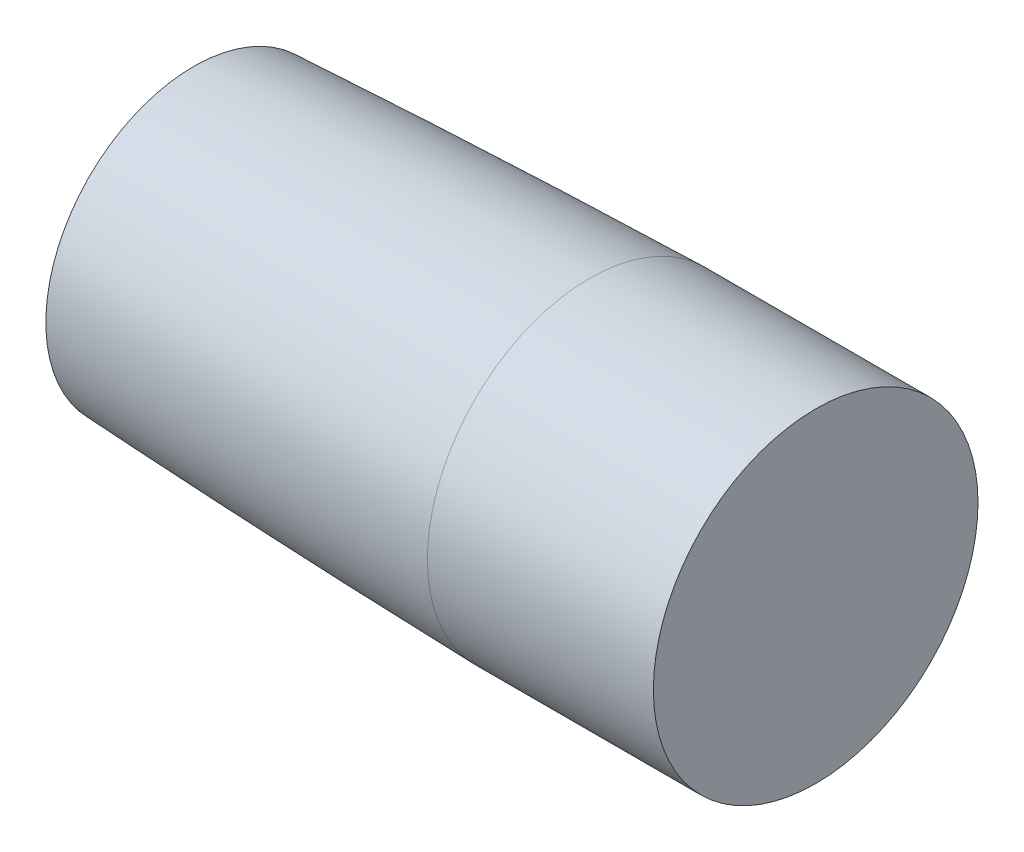
ISO-10303-21;
HEADER;
FILE_DESCRIPTION(('STEP AP214'),'2;1');
FILE_NAME('part.step','',(''),(''),'','','');
FILE_SCHEMA(('AUTOMOTIVE_DESIGN { 1 0 10303 214 1 1 1 1 }'));
ENDSEC;
DATA;
#1=APPLICATION_CONTEXT('core data for automotive mechanical design processes');
#2=APPLICATION_PROTOCOL_DEFINITION('international standard','automotive_design',2000,#1);
#3=PRODUCT_CONTEXT('',#1,'mechanical');
#4=PRODUCT('Part','Part','',(#3));
#5=PRODUCT_RELATED_PRODUCT_CATEGORY('part','',(#4));
#6=PRODUCT_DEFINITION_FORMATION('','',#4);
#7=PRODUCT_DEFINITION_CONTEXT('part definition',#1,'design');
#8=PRODUCT_DEFINITION('design','',#6,#7);
#9=PRODUCT_DEFINITION_SHAPE('','',#8);
#10=(LENGTH_UNIT() NAMED_UNIT(*) SI_UNIT(.MILLI.,.METRE.));
#11=(NAMED_UNIT(*) PLANE_ANGLE_UNIT() SI_UNIT($,.RADIAN.));
#12=(NAMED_UNIT(*) SI_UNIT($,.STERADIAN.) SOLID_ANGLE_UNIT());
#13=UNCERTAINTY_MEASURE_WITH_UNIT(LENGTH_MEASURE(1.E-05),#10,'distance_accuracy_value','');
#14=(GEOMETRIC_REPRESENTATION_CONTEXT(3) GLOBAL_UNCERTAINTY_ASSIGNED_CONTEXT((#13)) GLOBAL_UNIT_ASSIGNED_CONTEXT((#10,
#11,#12)) REPRESENTATION_CONTEXT('',''));
#15=CARTESIAN_POINT('',(0.,0.,0.));
#16=DIRECTION('',(0.,0.,1.));
#17=DIRECTION('',(1.,0.,0.));
#18=AXIS2_PLACEMENT_3D('',#15,#16,#17);
#19=CARTESIAN_POINT('',(558.670000001364,0.,-48.6046343758695));
#20=DIRECTION('',(1.,0.,0.));
#21=DIRECTION('',(0.,0.,-1.));
#22=AXIS2_PLACEMENT_3D('',#19,#20,#21);
#23=PLANE('',#22);
#24=CARTESIAN_POINT('',(558.670000001364,0.,-1.93823254878289E-11));
#25=DIRECTION('',(1.,0.,0.));
#26=DIRECTION('',(0.,0.,-1.));
#27=AXIS2_PLACEMENT_3D('',#24,#25,#26);
#28=CIRCLE('',#27,48.6046343758501);
#29=CARTESIAN_POINT('',(558.670000001364,0.,-48.6046343758695));
#30=VERTEX_POINT('',#29);
#31=EDGE_CURVE('E10',#30,#30,#28,.T.);
#32=ORIENTED_EDGE('',*,*,#31,.T.);
#33=EDGE_LOOP('',(#32));
#34=FACE_BOUND('',#33,.T.);
#35=ADVANCED_FACE('F43',(#34),#23,.T.);
#36=CARTESIAN_POINT('',(558.670000001364,0.,-1.93823254878289E-11));
#37=DIRECTION('',(1.,0.,0.));
#38=DIRECTION('',(0.,0.,-1.));
#39=AXIS2_PLACEMENT_3D('',#36,#37,#38);
#40=CYLINDRICAL_SURFACE('',#39,48.6046343758501);
#41=CARTESIAN_POINT('',(490.97000000136,0.,-1.93740346289987E-11));
#42=DIRECTION('',(1.,0.,0.));
#43=DIRECTION('',(0.,0.,-1.));
#44=AXIS2_PLACEMENT_3D('',#41,#42,#43);
#45=CIRCLE('',#44,48.6046343758501);
#46=CARTESIAN_POINT('',(490.97000000136,0.,-48.6046343758695));
#47=VERTEX_POINT('',#46);
#48=EDGE_CURVE('E50',#47,#47,#45,.T.);
#49=ORIENTED_EDGE('',*,*,#48,.T.);
#50=EDGE_LOOP('',(#49));
#51=FACE_BOUND('',#50,.T.);
#52=ORIENTED_EDGE('',*,*,#31,.F.);
#53=EDGE_LOOP('',(#52));
#54=FACE_BOUND('',#53,.T.);
#55=ADVANCED_FACE('F77',(#51,#54),#40,.T.);
#56=CARTESIAN_POINT('',(490.969999999604,0.,-48.6046343758284));
#57=CARTESIAN_POINT('',(490.119892858577,0.,-48.5847482846401));
#58=CARTESIAN_POINT('',(488.446752276637,0.,-48.5449792527331));
#59=CARTESIAN_POINT('',(484.034218998498,0.,-48.4386072519041));
#60=CARTESIAN_POINT('',(479.399328001613,0.,-48.3195658633744));
#61=CARTESIAN_POINT('',(472.357001172578,0.,-48.1337155896869));
#62=CARTESIAN_POINT('',(465.238649857594,0.,-47.9306600222412));
#63=CARTESIAN_POINT('',(456.867103280767,0.,-47.6804685510237));
#64=CARTESIAN_POINT('',(448.841258040353,0.,-47.4236668039986));
#65=CARTESIAN_POINT('',(440.615801080001,0.,-47.1478170173878));
#66=CARTESIAN_POINT('',(432.504772066787,0.,-46.8597942312719));
#67=CARTESIAN_POINT('',(424.336059227593,0.,-46.5563259220241));
#68=CARTESIAN_POINT('',(416.185050409703,0.,-46.2378502182403));
#69=CARTESIAN_POINT('',(408.31219572247,0.,-45.9170408199936));
#70=CARTESIAN_POINT('',(401.393886451412,0.,-45.6221645826462));
#71=CARTESIAN_POINT('',(395.609288848045,0.,-45.3682295203133));
#72=CARTESIAN_POINT('',(390.662627743398,0.,-45.1444199013388));
#73=CARTESIAN_POINT('',(386.793545066793,0.,-44.9670494702409));
#74=CARTESIAN_POINT('',(382.33866184157,0.,-44.7567288743538));
#75=CARTESIAN_POINT('',(378.947512637388,0.,-44.5955967437833));
#76=CARTESIAN_POINT('',(374.969132917005,0.,-44.4005017630998));
#77=CARTESIAN_POINT('',(373.249289150411,0.,-44.3155658492062));
#78=CARTESIAN_POINT('',(372.399999999608,0.,-44.2733098966417));
#79=B_SPLINE_CURVE_WITH_KNOTS('',4,(#56,#57,#58,#59,#60,#61,#62,#63,#64,#65,#66,#67,#68,#69,#70,
#71,#72,#73,#74,#75,#76,#77,#78),.UNSPECIFIED.,.F.,.F.,(5,1,1,1,1,1,1,1,1,1,1,1,1,1,1,1,1,1,1,
5),(0.0826180841510077,0.111284648281366,0.139951212525531,0.178524604197355,0.235857732634476,
0.293190861161631,0.35052398958415,0.407857118097007,0.465190246547421,0.522523375013487,
0.579856503533887,0.637189631943483,0.694522760479302,0.744636551924496,0.773303116120386,
0.801969680275465,0.830636244695114,0.859302808794101,0.887969372998832,0.916635937482005),.UNSPECIFIED.);
#80=CARTESIAN_POINT('',(558.670000001364,0.,-1.93823254878289E-11));
#81=DIRECTION('',(1.,0.,0.));
#82=AXIS1_PLACEMENT('',#80,#81);
#83=SURFACE_OF_REVOLUTION('',#79,#82);
#84=CARTESIAN_POINT('',(372.399999999608,0.,-1.9359513991901E-11));
#85=DIRECTION('',(1.,0.,0.));
#86=DIRECTION('',(0.,0.,-1.));
#87=AXIS2_PLACEMENT_3D('',#84,#85,#86);
#88=CIRCLE('',#87,44.2733098966223);
#89=CARTESIAN_POINT('',(372.399999999608,0.,-44.2733098966417));
#90=VERTEX_POINT('',#89);
#91=EDGE_CURVE('E55',#90,#90,#88,.T.);
#92=ORIENTED_EDGE('',*,*,#91,.T.);
#93=EDGE_LOOP('',(#92));
#94=FACE_BOUND('',#93,.T.);
#95=ORIENTED_EDGE('',*,*,#48,.F.);
#96=EDGE_LOOP('',(#95));
#97=FACE_BOUND('',#96,.T.);
#98=ADVANCED_FACE('F73',(#94,#97),#83,.F.);
#99=CARTESIAN_POINT('',(372.400000000486,0.,-44.273309896729));
#100=DIRECTION('',(-1.,0.,0.));
#101=DIRECTION('',(0.,0.,1.));
#102=AXIS2_PLACEMENT_3D('',#99,#100,#101);
#103=PLANE('',#102);
#104=CARTESIAN_POINT('',(372.400000000486,0.,0.));
#105=DIRECTION('',(-1.,0.,0.));
#106=DIRECTION('',(0.,0.,1.));
#107=AXIS2_PLACEMENT_3D('',#104,#105,#106);
#108=CIRCLE('',#107,12.7);
#109=CARTESIAN_POINT('',(372.400000000486,0.,12.7));
#110=VERTEX_POINT('',#109);
#111=EDGE_CURVE('E67',#110,#110,#108,.T.);
#112=ORIENTED_EDGE('',*,*,#111,.F.);
#113=EDGE_LOOP('',(#112));
#114=FACE_BOUND('',#113,.T.);
#115=ORIENTED_EDGE('',*,*,#91,.F.);
#116=EDGE_LOOP('',(#115));
#117=FACE_BOUND('',#116,.T.);
#118=ADVANCED_FACE('F76',(#114,#117),#103,.T.);
#119=CARTESIAN_POINT('',(423.200000000486,0.,0.));
#120=DIRECTION('',(-1.,0.,0.));
#121=DIRECTION('',(0.,0.,1.));
#122=AXIS2_PLACEMENT_3D('',#119,#120,#121);
#123=CYLINDRICAL_SURFACE('',#122,12.7);
#124=CARTESIAN_POINT('',(423.200000000486,0.,0.));
#125=DIRECTION('',(-1.,0.,0.));
#126=DIRECTION('',(0.,0.,1.));
#127=AXIS2_PLACEMENT_3D('',#124,#125,#126);
#128=CIRCLE('',#127,12.7);
#129=CARTESIAN_POINT('',(423.200000000486,0.,12.6999999999999));
#130=VERTEX_POINT('',#129);
#131=EDGE_CURVE('E60',#130,#130,#128,.T.);
#132=ORIENTED_EDGE('',*,*,#131,.F.);
#133=EDGE_LOOP('',(#132));
#134=FACE_BOUND('',#133,.T.);
#135=ORIENTED_EDGE('',*,*,#111,.T.);
#136=EDGE_LOOP('',(#135));
#137=FACE_BOUND('',#136,.T.);
#138=ADVANCED_FACE('F107',(#134,#137),#123,.F.);
#139=CARTESIAN_POINT('',(423.200000000486,0.,0.));
#140=DIRECTION('',(-1.,0.,0.));
#141=DIRECTION('',(0.,0.,1.));
#142=AXIS2_PLACEMENT_3D('',#139,#140,#141);
#143=PLANE('',#142);
#144=ORIENTED_EDGE('',*,*,#131,.T.);
#145=EDGE_LOOP('',(#144));
#146=FACE_BOUND('',#145,.T.);
#147=ADVANCED_FACE('F116',(#146),#143,.T.);
#148=CLOSED_SHELL('',(#35,#55,#98,#118,#138,#147));
#149=MANIFOLD_SOLID_BREP('B2',#148);
#150=ADVANCED_BREP_SHAPE_REPRESENTATION('',(#18,#149),#14);
#151=SHAPE_DEFINITION_REPRESENTATION(#9,#150);
ENDSEC;
END-ISO-10303-21;
